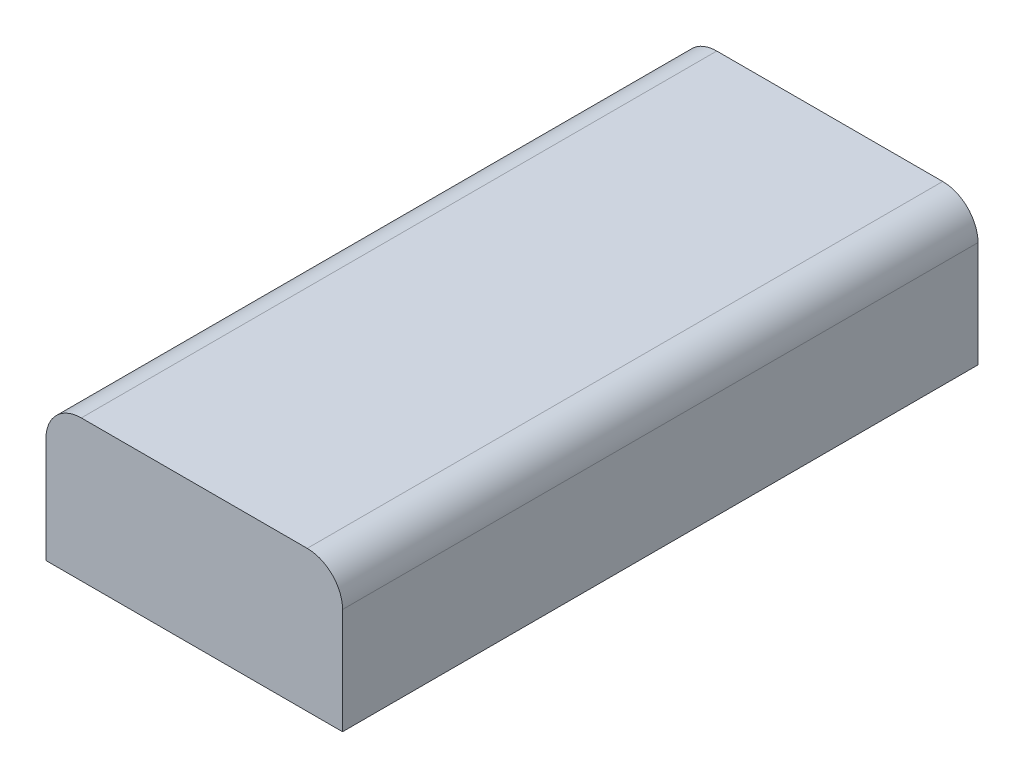
ISO-10303-21;
HEADER;
FILE_DESCRIPTION(('STEP AP214'),'2;1');
FILE_NAME('part.step','',(''),(''),'','','');
FILE_SCHEMA(('AUTOMOTIVE_DESIGN { 1 0 10303 214 1 1 1 1 }'));
ENDSEC;
DATA;
#1=APPLICATION_CONTEXT('core data for automotive mechanical design processes');
#2=APPLICATION_PROTOCOL_DEFINITION('international standard','automotive_design',2000,#1);
#3=PRODUCT_CONTEXT('',#1,'mechanical');
#4=PRODUCT('Part','Part','',(#3));
#5=PRODUCT_RELATED_PRODUCT_CATEGORY('part','',(#4));
#6=PRODUCT_DEFINITION_FORMATION('','',#4);
#7=PRODUCT_DEFINITION_CONTEXT('part definition',#1,'design');
#8=PRODUCT_DEFINITION('design','',#6,#7);
#9=PRODUCT_DEFINITION_SHAPE('','',#8);
#10=(LENGTH_UNIT() NAMED_UNIT(*) SI_UNIT(.MILLI.,.METRE.));
#11=(NAMED_UNIT(*) PLANE_ANGLE_UNIT() SI_UNIT($,.RADIAN.));
#12=(NAMED_UNIT(*) SI_UNIT($,.STERADIAN.) SOLID_ANGLE_UNIT());
#13=UNCERTAINTY_MEASURE_WITH_UNIT(LENGTH_MEASURE(1.E-05),#10,'distance_accuracy_value','');
#14=(GEOMETRIC_REPRESENTATION_CONTEXT(3) GLOBAL_UNCERTAINTY_ASSIGNED_CONTEXT((#13)) GLOBAL_UNIT_ASSIGNED_CONTEXT((#10,
#11,#12)) REPRESENTATION_CONTEXT('',''));
#15=CARTESIAN_POINT('',(0.,0.,0.));
#16=DIRECTION('',(0.,0.,1.));
#17=DIRECTION('',(1.,0.,0.));
#18=AXIS2_PLACEMENT_3D('',#15,#16,#17);
#19=CARTESIAN_POINT('',(0.,0.,90.));
#20=DIRECTION('',(1.,0.,0.));
#21=DIRECTION('',(0.,1.,0.));
#22=AXIS2_PLACEMENT_3D('',#19,#20,#21);
#23=PLANE('',#22);
#24=DIRECTION('',(0.,-1.,0.));
#25=VECTOR('',#24,1.);
#26=CARTESIAN_POINT('',(0.,0.,90.));
#27=LINE('',#26,#25);
#28=CARTESIAN_POINT('',(0.,-5.,90.));
#29=VERTEX_POINT('',#28);
#30=CARTESIAN_POINT('',(0.,-20.,90.));
#31=VERTEX_POINT('',#30);
#32=EDGE_CURVE('E91',#29,#31,#27,.T.);
#33=ORIENTED_EDGE('',*,*,#32,.F.);
#34=DIRECTION('',(0.,0.,-1.));
#35=VECTOR('',#34,1.);
#36=CARTESIAN_POINT('',(0.,-5.,90.));
#37=LINE('',#36,#35);
#38=CARTESIAN_POINT('',(0.,-5.,0.));
#39=VERTEX_POINT('',#38);
#40=EDGE_CURVE('E137',#29,#39,#37,.T.);
#41=ORIENTED_EDGE('',*,*,#40,.T.);
#42=DIRECTION('',(0.,-1.,0.));
#43=VECTOR('',#42,1.);
#44=CARTESIAN_POINT('',(0.,0.,0.));
#45=LINE('',#44,#43);
#46=CARTESIAN_POINT('',(0.,-20.,0.));
#47=VERTEX_POINT('',#46);
#48=EDGE_CURVE('E115',#39,#47,#45,.T.);
#49=ORIENTED_EDGE('',*,*,#48,.T.);
#50=DIRECTION('',(0.,0.,-1.));
#51=VECTOR('',#50,1.);
#52=CARTESIAN_POINT('',(0.,-20.,90.));
#53=LINE('',#52,#51);
#54=EDGE_CURVE('E108',#31,#47,#53,.T.);
#55=ORIENTED_EDGE('',*,*,#54,.F.);
#56=EDGE_LOOP('',(#33,#41,#49,#55));
#57=FACE_BOUND('',#56,.T.);
#58=ADVANCED_FACE('F38',(#57),#23,.F.);
#59=CARTESIAN_POINT('',(0.,-20.,90.));
#60=DIRECTION('',(0.,1.,0.));
#61=DIRECTION('',(0.,0.,1.));
#62=AXIS2_PLACEMENT_3D('',#59,#60,#61);
#63=PLANE('',#62);
#64=CARTESIAN_POINT('',(8.50000000000003,-20.,28.));
#65=DIRECTION('',(0.,-1.,0.));
#66=DIRECTION('',(0.,0.,1.));
#67=AXIS2_PLACEMENT_3D('',#64,#65,#66);
#68=CIRCLE('',#67,1.75);
#69=CARTESIAN_POINT('',(8.50000000000003,-20.,29.75));
#70=VERTEX_POINT('',#69);
#71=EDGE_CURVE('E247',#70,#70,#68,.T.);
#72=ORIENTED_EDGE('',*,*,#71,.F.);
#73=EDGE_LOOP('',(#72));
#74=FACE_BOUND('',#73,.T.);
#75=CARTESIAN_POINT('',(33.5,-20.,28.));
#76=DIRECTION('',(0.,-1.,0.));
#77=DIRECTION('',(0.,0.,1.));
#78=AXIS2_PLACEMENT_3D('',#75,#76,#77);
#79=CIRCLE('',#78,1.75);
#80=CARTESIAN_POINT('',(33.5,-20.,29.75));
#81=VERTEX_POINT('',#80);
#82=EDGE_CURVE('E239',#81,#81,#79,.T.);
#83=ORIENTED_EDGE('',*,*,#82,.F.);
#84=EDGE_LOOP('',(#83));
#85=FACE_BOUND('',#84,.T.);
#86=CARTESIAN_POINT('',(33.5,-20.,62.));
#87=DIRECTION('',(0.,-1.,0.));
#88=DIRECTION('',(0.,0.,-1.));
#89=AXIS2_PLACEMENT_3D('',#86,#87,#88);
#90=CIRCLE('',#89,1.75);
#91=CARTESIAN_POINT('',(33.5,-20.,60.25));
#92=VERTEX_POINT('',#91);
#93=EDGE_CURVE('E226',#92,#92,#90,.T.);
#94=ORIENTED_EDGE('',*,*,#93,.F.);
#95=EDGE_LOOP('',(#94));
#96=FACE_BOUND('',#95,.T.);
#97=CARTESIAN_POINT('',(8.5,-20.,62.));
#98=DIRECTION('',(0.,-1.,0.));
#99=DIRECTION('',(0.,0.,-1.));
#100=AXIS2_PLACEMENT_3D('',#97,#98,#99);
#101=CIRCLE('',#100,1.75);
#102=CARTESIAN_POINT('',(8.5,-20.,60.25));
#103=VERTEX_POINT('',#102);
#104=EDGE_CURVE('E154',#103,#103,#101,.T.);
#105=ORIENTED_EDGE('',*,*,#104,.F.);
#106=EDGE_LOOP('',(#105));
#107=FACE_BOUND('',#106,.T.);
#108=DIRECTION('',(1.,0.,0.));
#109=VECTOR('',#108,1.);
#110=CARTESIAN_POINT('',(0.,-20.,0.));
#111=LINE('',#110,#109);
#112=CARTESIAN_POINT('',(42.,-20.,0.));
#113=VERTEX_POINT('',#112);
#114=EDGE_CURVE('E145',#47,#113,#111,.T.);
#115=ORIENTED_EDGE('',*,*,#114,.T.);
#116=DIRECTION('',(0.,0.,-1.));
#117=VECTOR('',#116,1.);
#118=CARTESIAN_POINT('',(42.,-20.,90.));
#119=LINE('',#118,#117);
#120=CARTESIAN_POINT('',(42.,-20.,90.));
#121=VERTEX_POINT('',#120);
#122=EDGE_CURVE('E110',#121,#113,#119,.T.);
#123=ORIENTED_EDGE('',*,*,#122,.F.);
#124=DIRECTION('',(1.,0.,0.));
#125=VECTOR('',#124,1.);
#126=CARTESIAN_POINT('',(0.,-20.,90.));
#127=LINE('',#126,#125);
#128=EDGE_CURVE('E95',#31,#121,#127,.T.);
#129=ORIENTED_EDGE('',*,*,#128,.F.);
#130=ORIENTED_EDGE('',*,*,#54,.T.);
#131=EDGE_LOOP('',(#115,#123,#129,#130));
#132=FACE_BOUND('',#131,.T.);
#133=ADVANCED_FACE('F107',(#74,#85,#96,#107,#132),#63,.F.);
#134=CARTESIAN_POINT('',(42.,0.,90.));
#135=DIRECTION('',(-1.,0.,0.));
#136=DIRECTION('',(0.,0.,1.));
#137=AXIS2_PLACEMENT_3D('',#134,#135,#136);
#138=PLANE('',#137);
#139=DIRECTION('',(0.,1.,0.));
#140=VECTOR('',#139,1.);
#141=CARTESIAN_POINT('',(42.,0.,0.));
#142=LINE('',#141,#140);
#143=CARTESIAN_POINT('',(42.,-5.,0.));
#144=VERTEX_POINT('',#143);
#145=EDGE_CURVE('E151',#113,#144,#142,.T.);
#146=ORIENTED_EDGE('',*,*,#145,.T.);
#147=DIRECTION('',(0.,0.,-1.));
#148=VECTOR('',#147,1.);
#149=CARTESIAN_POINT('',(42.,-5.,90.));
#150=LINE('',#149,#148);
#151=CARTESIAN_POINT('',(42.,-5.,90.));
#152=VERTEX_POINT('',#151);
#153=EDGE_CURVE('E131',#144,#152,#150,.F.);
#154=ORIENTED_EDGE('',*,*,#153,.T.);
#155=DIRECTION('',(0.,1.,0.));
#156=VECTOR('',#155,1.);
#157=CARTESIAN_POINT('',(42.,0.,90.));
#158=LINE('',#157,#156);
#159=EDGE_CURVE('E113',#121,#152,#158,.T.);
#160=ORIENTED_EDGE('',*,*,#159,.F.);
#161=ORIENTED_EDGE('',*,*,#122,.T.);
#162=EDGE_LOOP('',(#146,#154,#160,#161));
#163=FACE_BOUND('',#162,.T.);
#164=ADVANCED_FACE('F178',(#163),#138,.F.);
#165=CARTESIAN_POINT('',(0.,0.,90.));
#166=DIRECTION('',(0.,-1.,0.));
#167=DIRECTION('',(0.,0.,-1.));
#168=AXIS2_PLACEMENT_3D('',#165,#166,#167);
#169=PLANE('',#168);
#170=DIRECTION('',(-1.,0.,0.));
#171=VECTOR('',#170,1.);
#172=CARTESIAN_POINT('',(0.,0.,0.));
#173=LINE('',#172,#171);
#174=CARTESIAN_POINT('',(37.,0.,0.));
#175=VERTEX_POINT('',#174);
#176=CARTESIAN_POINT('',(5.,0.,0.));
#177=VERTEX_POINT('',#176);
#178=EDGE_CURVE('E103',#175,#177,#173,.T.);
#179=ORIENTED_EDGE('',*,*,#178,.T.);
#180=DIRECTION('',(0.,0.,-1.));
#181=VECTOR('',#180,1.);
#182=CARTESIAN_POINT('',(5.,0.,90.));
#183=LINE('',#182,#181);
#184=CARTESIAN_POINT('',(5.,0.,90.));
#185=VERTEX_POINT('',#184);
#186=EDGE_CURVE('E47',#177,#185,#183,.F.);
#187=ORIENTED_EDGE('',*,*,#186,.T.);
#188=DIRECTION('',(-1.,0.,0.));
#189=VECTOR('',#188,1.);
#190=CARTESIAN_POINT('',(0.,0.,90.));
#191=LINE('',#190,#189);
#192=CARTESIAN_POINT('',(37.,0.,90.));
#193=VERTEX_POINT('',#192);
#194=EDGE_CURVE('E125',#193,#185,#191,.T.);
#195=ORIENTED_EDGE('',*,*,#194,.F.);
#196=DIRECTION('',(0.,0.,-1.));
#197=VECTOR('',#196,1.);
#198=CARTESIAN_POINT('',(37.,0.,90.));
#199=LINE('',#198,#197);
#200=EDGE_CURVE('E118',#193,#175,#199,.T.);
#201=ORIENTED_EDGE('',*,*,#200,.T.);
#202=EDGE_LOOP('',(#179,#187,#195,#201));
#203=FACE_BOUND('',#202,.T.);
#204=ADVANCED_FACE('F162',(#203),#169,.F.);
#205=CARTESIAN_POINT('',(0.,0.,90.));
#206=DIRECTION('',(0.,0.,1.));
#207=DIRECTION('',(1.,0.,0.));
#208=AXIS2_PLACEMENT_3D('',#205,#206,#207);
#209=PLANE('',#208);
#210=ORIENTED_EDGE('',*,*,#194,.T.);
#211=CARTESIAN_POINT('',(5.,-5.,90.));
#212=DIRECTION('',(0.,0.,1.));
#213=DIRECTION('',(1.,0.,0.));
#214=AXIS2_PLACEMENT_3D('',#211,#212,#213);
#215=CIRCLE('',#214,5.);
#216=EDGE_CURVE('E11',#185,#29,#215,.T.);
#217=ORIENTED_EDGE('',*,*,#216,.T.);
#218=ORIENTED_EDGE('',*,*,#32,.T.);
#219=ORIENTED_EDGE('',*,*,#128,.T.);
#220=ORIENTED_EDGE('',*,*,#159,.T.);
#221=CARTESIAN_POINT('',(37.,-5.,90.));
#222=DIRECTION('',(0.,0.,1.));
#223=DIRECTION('',(1.,0.,0.));
#224=AXIS2_PLACEMENT_3D('',#221,#222,#223);
#225=CIRCLE('',#224,5.);
#226=EDGE_CURVE('E134',#152,#193,#225,.T.);
#227=ORIENTED_EDGE('',*,*,#226,.T.);
#228=EDGE_LOOP('',(#210,#217,#218,#219,#220,#227));
#229=FACE_BOUND('',#228,.T.);
#230=ADVANCED_FACE('F93',(#229),#209,.T.);
#231=CARTESIAN_POINT('',(0.,0.,0.));
#232=DIRECTION('',(0.,0.,1.));
#233=DIRECTION('',(1.,0.,0.));
#234=AXIS2_PLACEMENT_3D('',#231,#232,#233);
#235=PLANE('',#234);
#236=ORIENTED_EDGE('',*,*,#48,.F.);
#237=CARTESIAN_POINT('',(5.,-5.,0.));
#238=DIRECTION('',(0.,0.,1.));
#239=DIRECTION('',(1.,0.,0.));
#240=AXIS2_PLACEMENT_3D('',#237,#238,#239);
#241=CIRCLE('',#240,5.);
#242=EDGE_CURVE('E61',#39,#177,#241,.F.);
#243=ORIENTED_EDGE('',*,*,#242,.T.);
#244=ORIENTED_EDGE('',*,*,#178,.F.);
#245=CARTESIAN_POINT('',(37.,-5.,0.));
#246=DIRECTION('',(0.,0.,1.));
#247=DIRECTION('',(1.,0.,0.));
#248=AXIS2_PLACEMENT_3D('',#245,#246,#247);
#249=CIRCLE('',#248,5.);
#250=EDGE_CURVE('E123',#175,#144,#249,.F.);
#251=ORIENTED_EDGE('',*,*,#250,.T.);
#252=ORIENTED_EDGE('',*,*,#145,.F.);
#253=ORIENTED_EDGE('',*,*,#114,.F.);
#254=EDGE_LOOP('',(#236,#243,#244,#251,#252,#253));
#255=FACE_BOUND('',#254,.T.);
#256=ADVANCED_FACE('F143',(#255),#235,.F.);
#257=CARTESIAN_POINT('',(8.5,-17.,62.));
#258=DIRECTION('',(0.,-1.,0.));
#259=DIRECTION('',(0.,0.,-1.));
#260=AXIS2_PLACEMENT_3D('',#257,#258,#259);
#261=CYLINDRICAL_SURFACE('',#260,1.75);
#262=CARTESIAN_POINT('',(8.5,-17.,62.));
#263=DIRECTION('',(0.,-1.,0.));
#264=DIRECTION('',(0.,0.,-1.));
#265=AXIS2_PLACEMENT_3D('',#262,#263,#264);
#266=CIRCLE('',#265,1.75);
#267=CARTESIAN_POINT('',(8.5,-17.,60.25));
#268=VERTEX_POINT('',#267);
#269=EDGE_CURVE('E147',#268,#268,#266,.T.);
#270=ORIENTED_EDGE('',*,*,#269,.F.);
#271=EDGE_LOOP('',(#270));
#272=FACE_BOUND('',#271,.T.);
#273=ORIENTED_EDGE('',*,*,#104,.T.);
#274=EDGE_LOOP('',(#273));
#275=FACE_BOUND('',#274,.T.);
#276=ADVANCED_FACE('F188',(#272,#275),#261,.F.);
#277=CARTESIAN_POINT('',(8.5,-17.,62.));
#278=DIRECTION('',(0.,-1.,0.));
#279=DIRECTION('',(0.,0.,-1.));
#280=AXIS2_PLACEMENT_3D('',#277,#278,#279);
#281=PLANE('',#280);
#282=ORIENTED_EDGE('',*,*,#269,.T.);
#283=EDGE_LOOP('',(#282));
#284=FACE_BOUND('',#283,.T.);
#285=ADVANCED_FACE('F193',(#284),#281,.T.);
#286=CARTESIAN_POINT('',(33.5,-17.,62.));
#287=DIRECTION('',(0.,-1.,0.));
#288=DIRECTION('',(0.,0.,-1.));
#289=AXIS2_PLACEMENT_3D('',#286,#287,#288);
#290=CYLINDRICAL_SURFACE('',#289,1.75);
#291=CARTESIAN_POINT('',(33.5,-17.,62.));
#292=DIRECTION('',(0.,-1.,0.));
#293=DIRECTION('',(0.,0.,-1.));
#294=AXIS2_PLACEMENT_3D('',#291,#292,#293);
#295=CIRCLE('',#294,1.75);
#296=CARTESIAN_POINT('',(33.5,-17.,60.25));
#297=VERTEX_POINT('',#296);
#298=EDGE_CURVE('E224',#297,#297,#295,.T.);
#299=ORIENTED_EDGE('',*,*,#298,.F.);
#300=EDGE_LOOP('',(#299));
#301=FACE_BOUND('',#300,.T.);
#302=ORIENTED_EDGE('',*,*,#93,.T.);
#303=EDGE_LOOP('',(#302));
#304=FACE_BOUND('',#303,.T.);
#305=ADVANCED_FACE('F197',(#301,#304),#290,.F.);
#306=CARTESIAN_POINT('',(33.5,-17.,62.));
#307=DIRECTION('',(0.,-1.,0.));
#308=DIRECTION('',(0.,0.,-1.));
#309=AXIS2_PLACEMENT_3D('',#306,#307,#308);
#310=PLANE('',#309);
#311=ORIENTED_EDGE('',*,*,#298,.T.);
#312=EDGE_LOOP('',(#311));
#313=FACE_BOUND('',#312,.T.);
#314=ADVANCED_FACE('F210',(#313),#310,.T.);
#315=CARTESIAN_POINT('',(33.5,-17.,28.));
#316=DIRECTION('',(0.,-1.,0.));
#317=DIRECTION('',(0.,0.,-1.));
#318=AXIS2_PLACEMENT_3D('',#315,#316,#317);
#319=CYLINDRICAL_SURFACE('',#318,1.75);
#320=CARTESIAN_POINT('',(33.5,-17.,28.));
#321=DIRECTION('',(0.,-1.,0.));
#322=DIRECTION('',(0.,0.,1.));
#323=AXIS2_PLACEMENT_3D('',#320,#321,#322);
#324=CIRCLE('',#323,1.75);
#325=CARTESIAN_POINT('',(33.5,-17.,29.75));
#326=VERTEX_POINT('',#325);
#327=EDGE_CURVE('E233',#326,#326,#324,.T.);
#328=ORIENTED_EDGE('',*,*,#327,.F.);
#329=EDGE_LOOP('',(#328));
#330=FACE_BOUND('',#329,.T.);
#331=ORIENTED_EDGE('',*,*,#82,.T.);
#332=EDGE_LOOP('',(#331));
#333=FACE_BOUND('',#332,.T.);
#334=ADVANCED_FACE('F207',(#330,#333),#319,.F.);
#335=CARTESIAN_POINT('',(33.5,-17.,28.));
#336=DIRECTION('',(0.,1.,0.));
#337=DIRECTION('',(0.,0.,1.));
#338=AXIS2_PLACEMENT_3D('',#335,#336,#337);
#339=PLANE('',#338);
#340=ORIENTED_EDGE('',*,*,#327,.T.);
#341=EDGE_LOOP('',(#340));
#342=FACE_BOUND('',#341,.T.);
#343=ADVANCED_FACE('F202',(#342),#339,.F.);
#344=CARTESIAN_POINT('',(8.50000000000003,-17.,28.));
#345=DIRECTION('',(0.,-1.,0.));
#346=DIRECTION('',(0.,0.,-1.));
#347=AXIS2_PLACEMENT_3D('',#344,#345,#346);
#348=CYLINDRICAL_SURFACE('',#347,1.75);
#349=CARTESIAN_POINT('',(8.50000000000003,-17.,28.));
#350=DIRECTION('',(0.,-1.,0.));
#351=DIRECTION('',(0.,0.,1.));
#352=AXIS2_PLACEMENT_3D('',#349,#350,#351);
#353=CIRCLE('',#352,1.75);
#354=CARTESIAN_POINT('',(8.50000000000003,-17.,29.75));
#355=VERTEX_POINT('',#354);
#356=EDGE_CURVE('E243',#355,#355,#353,.T.);
#357=ORIENTED_EDGE('',*,*,#356,.F.);
#358=EDGE_LOOP('',(#357));
#359=FACE_BOUND('',#358,.T.);
#360=ORIENTED_EDGE('',*,*,#71,.T.);
#361=EDGE_LOOP('',(#360));
#362=FACE_BOUND('',#361,.T.);
#363=ADVANCED_FACE('F199',(#359,#362),#348,.F.);
#364=CARTESIAN_POINT('',(8.50000000000003,-17.,28.));
#365=DIRECTION('',(0.,1.,0.));
#366=DIRECTION('',(0.,0.,1.));
#367=AXIS2_PLACEMENT_3D('',#364,#365,#366);
#368=PLANE('',#367);
#369=ORIENTED_EDGE('',*,*,#356,.T.);
#370=EDGE_LOOP('',(#369));
#371=FACE_BOUND('',#370,.T.);
#372=ADVANCED_FACE('F169',(#371),#368,.F.);
#373=CARTESIAN_POINT('',(37.,-5.,90.));
#374=DIRECTION('',(0.,0.,-1.));
#375=DIRECTION('',(-1.,0.,0.));
#376=AXIS2_PLACEMENT_3D('',#373,#374,#375);
#377=CYLINDRICAL_SURFACE('',#376,5.);
#378=ORIENTED_EDGE('',*,*,#226,.F.);
#379=ORIENTED_EDGE('',*,*,#153,.F.);
#380=ORIENTED_EDGE('',*,*,#250,.F.);
#381=ORIENTED_EDGE('',*,*,#200,.F.);
#382=EDGE_LOOP('',(#378,#379,#380,#381));
#383=FACE_BOUND('',#382,.T.);
#384=ADVANCED_FACE('F165',(#383),#377,.T.);
#385=CARTESIAN_POINT('',(5.,-5.,90.));
#386=DIRECTION('',(0.,0.,-1.));
#387=DIRECTION('',(-1.,0.,0.));
#388=AXIS2_PLACEMENT_3D('',#385,#386,#387);
#389=CYLINDRICAL_SURFACE('',#388,5.);
#390=ORIENTED_EDGE('',*,*,#216,.F.);
#391=ORIENTED_EDGE('',*,*,#186,.F.);
#392=ORIENTED_EDGE('',*,*,#242,.F.);
#393=ORIENTED_EDGE('',*,*,#40,.F.);
#394=EDGE_LOOP('',(#390,#391,#392,#393));
#395=FACE_BOUND('',#394,.T.);
#396=ADVANCED_FACE('F40',(#395),#389,.T.);
#397=CLOSED_SHELL('',(#58,#133,#164,#204,#230,#256,#276,#285,#305,#314,#334,#343,#363,#372,#384,#396));
#398=MANIFOLD_SOLID_BREP('B2',#397);
#399=ADVANCED_BREP_SHAPE_REPRESENTATION('',(#18,#398),#14);
#400=SHAPE_DEFINITION_REPRESENTATION(#9,#399);
ENDSEC;
END-ISO-10303-21;
